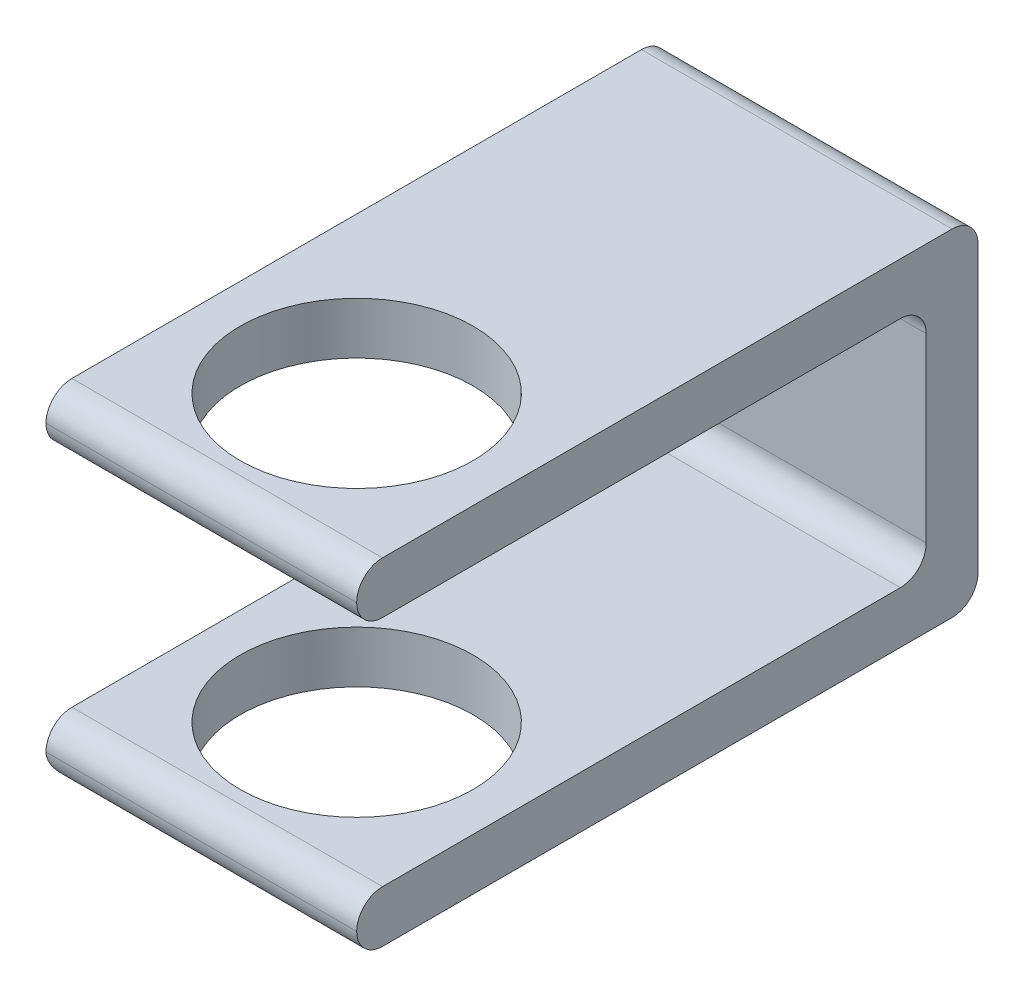
ISO-10303-21;
HEADER;
FILE_DESCRIPTION(('STEP AP214'),'2;1');
FILE_NAME('part.step','',(''),(''),'','','');
FILE_SCHEMA(('AUTOMOTIVE_DESIGN { 1 0 10303 214 1 1 1 1 }'));
ENDSEC;
DATA;
#1=APPLICATION_CONTEXT('core data for automotive mechanical design processes');
#2=APPLICATION_PROTOCOL_DEFINITION('international standard','automotive_design',2000,#1);
#3=PRODUCT_CONTEXT('',#1,'mechanical');
#4=PRODUCT('Part','Part','',(#3));
#5=PRODUCT_RELATED_PRODUCT_CATEGORY('part','',(#4));
#6=PRODUCT_DEFINITION_FORMATION('','',#4);
#7=PRODUCT_DEFINITION_CONTEXT('part definition',#1,'design');
#8=PRODUCT_DEFINITION('design','',#6,#7);
#9=PRODUCT_DEFINITION_SHAPE('','',#8);
#10=(LENGTH_UNIT() NAMED_UNIT(*) SI_UNIT(.MILLI.,.METRE.));
#11=(NAMED_UNIT(*) PLANE_ANGLE_UNIT() SI_UNIT($,.RADIAN.));
#12=(NAMED_UNIT(*) SI_UNIT($,.STERADIAN.) SOLID_ANGLE_UNIT());
#13=UNCERTAINTY_MEASURE_WITH_UNIT(LENGTH_MEASURE(1.E-05),#10,'distance_accuracy_value','');
#14=(GEOMETRIC_REPRESENTATION_CONTEXT(3) GLOBAL_UNCERTAINTY_ASSIGNED_CONTEXT((#13)) GLOBAL_UNIT_ASSIGNED_CONTEXT((#10,
#11,#12)) REPRESENTATION_CONTEXT('',''));
#15=CARTESIAN_POINT('',(0.,0.,0.));
#16=DIRECTION('',(0.,0.,1.));
#17=DIRECTION('',(1.,0.,0.));
#18=AXIS2_PLACEMENT_3D('',#15,#16,#17);
#19=CARTESIAN_POINT('',(19.05,41.275,38.1));
#20=DIRECTION('',(-1.,0.,0.));
#21=DIRECTION('',(0.,0.,1.));
#22=AXIS2_PLACEMENT_3D('',#19,#20,#21);
#23=PLANE('',#22);
#24=DIRECTION('',(0.,0.,-1.));
#25=VECTOR('',#24,1.);
#26=CARTESIAN_POINT('',(19.05,0.,38.1));
#27=LINE('',#26,#25);
#28=CARTESIAN_POINT('',(19.05,0.,34.925));
#29=VERTEX_POINT('',#28);
#30=CARTESIAN_POINT('',(19.05,0.,-34.925));
#31=VERTEX_POINT('',#30);
#32=EDGE_CURVE('E179',#29,#31,#27,.T.);
#33=ORIENTED_EDGE('',*,*,#32,.T.);
#34=CARTESIAN_POINT('',(19.05,3.175,-34.925));
#35=DIRECTION('',(-1.,0.,0.));
#36=DIRECTION('',(0.,0.,1.));
#37=AXIS2_PLACEMENT_3D('',#34,#35,#36);
#38=CIRCLE('',#37,3.175);
#39=CARTESIAN_POINT('',(19.05,3.175,-38.1));
#40=VERTEX_POINT('',#39);
#41=EDGE_CURVE('E215',#31,#40,#38,.F.);
#42=ORIENTED_EDGE('',*,*,#41,.T.);
#43=DIRECTION('',(0.,-1.,0.));
#44=VECTOR('',#43,1.);
#45=CARTESIAN_POINT('',(19.05,41.275,-38.1));
#46=LINE('',#45,#44);
#47=CARTESIAN_POINT('',(19.05,38.1,-38.1));
#48=VERTEX_POINT('',#47);
#49=EDGE_CURVE('E194',#48,#40,#46,.T.);
#50=ORIENTED_EDGE('',*,*,#49,.F.);
#51=CARTESIAN_POINT('',(19.05,38.1,-34.925));
#52=DIRECTION('',(-1.,0.,0.));
#53=DIRECTION('',(0.,0.,1.));
#54=AXIS2_PLACEMENT_3D('',#51,#52,#53);
#55=CIRCLE('',#54,3.175);
#56=CARTESIAN_POINT('',(19.05,41.275,-34.925));
#57=VERTEX_POINT('',#56);
#58=EDGE_CURVE('E172',#48,#57,#55,.F.);
#59=ORIENTED_EDGE('',*,*,#58,.T.);
#60=DIRECTION('',(0.,0.,-1.));
#61=VECTOR('',#60,1.);
#62=CARTESIAN_POINT('',(19.05,41.275,38.1));
#63=LINE('',#62,#61);
#64=CARTESIAN_POINT('',(19.05,41.275,34.925));
#65=VERTEX_POINT('',#64);
#66=EDGE_CURVE('E167',#65,#57,#63,.T.);
#67=ORIENTED_EDGE('',*,*,#66,.F.);
#68=CARTESIAN_POINT('',(19.05,38.1,34.925));
#69=DIRECTION('',(-1.,0.,0.));
#70=DIRECTION('',(0.,0.,1.));
#71=AXIS2_PLACEMENT_3D('',#68,#69,#70);
#72=CIRCLE('',#71,3.175);
#73=CARTESIAN_POINT('',(19.05,38.1,38.1));
#74=VERTEX_POINT('',#73);
#75=EDGE_CURVE('E148',#65,#74,#72,.F.);
#76=ORIENTED_EDGE('',*,*,#75,.T.);
#77=CARTESIAN_POINT('',(19.05,38.1,34.925));
#78=DIRECTION('',(-1.,0.,0.));
#79=DIRECTION('',(0.,0.,1.));
#80=AXIS2_PLACEMENT_3D('',#77,#78,#79);
#81=CIRCLE('',#80,3.175);
#82=CARTESIAN_POINT('',(19.05,34.925,34.925));
#83=VERTEX_POINT('',#82);
#84=EDGE_CURVE('E160',#74,#83,#81,.F.);
#85=ORIENTED_EDGE('',*,*,#84,.T.);
#86=DIRECTION('',(0.,0.,1.));
#87=VECTOR('',#86,1.);
#88=CARTESIAN_POINT('',(19.05,34.925,-85.725));
#89=LINE('',#88,#87);
#90=CARTESIAN_POINT('',(19.05,34.925,-28.575));
#91=VERTEX_POINT('',#90);
#92=EDGE_CURVE('E309',#91,#83,#89,.T.);
#93=ORIENTED_EDGE('',*,*,#92,.F.);
#94=CARTESIAN_POINT('',(19.05,31.75,-28.575));
#95=DIRECTION('',(-1.,0.,0.));
#96=DIRECTION('',(0.,0.,1.));
#97=AXIS2_PLACEMENT_3D('',#94,#95,#96);
#98=CIRCLE('',#97,3.175);
#99=CARTESIAN_POINT('',(19.05,31.75,-31.75));
#100=VERTEX_POINT('',#99);
#101=EDGE_CURVE('E55',#91,#100,#98,.T.);
#102=ORIENTED_EDGE('',*,*,#101,.T.);
#103=DIRECTION('',(0.,-1.,0.));
#104=VECTOR('',#103,1.);
#105=CARTESIAN_POINT('',(19.05,34.925,-31.75));
#106=LINE('',#105,#104);
#107=CARTESIAN_POINT('',(19.05,9.525,-31.75));
#108=VERTEX_POINT('',#107);
#109=EDGE_CURVE('E317',#100,#108,#106,.T.);
#110=ORIENTED_EDGE('',*,*,#109,.T.);
#111=CARTESIAN_POINT('',(19.05,9.525,-28.575));
#112=DIRECTION('',(-1.,0.,0.));
#113=DIRECTION('',(0.,0.,1.));
#114=AXIS2_PLACEMENT_3D('',#111,#112,#113);
#115=CIRCLE('',#114,3.175);
#116=CARTESIAN_POINT('',(19.05,6.35,-28.575));
#117=VERTEX_POINT('',#116);
#118=EDGE_CURVE('E270',#108,#117,#115,.T.);
#119=ORIENTED_EDGE('',*,*,#118,.T.);
#120=DIRECTION('',(0.,0.,1.));
#121=VECTOR('',#120,1.);
#122=CARTESIAN_POINT('',(19.05,6.35,-85.725));
#123=LINE('',#122,#121);
#124=CARTESIAN_POINT('',(19.05,6.35,34.925));
#125=VERTEX_POINT('',#124);
#126=EDGE_CURVE('E306',#117,#125,#123,.T.);
#127=ORIENTED_EDGE('',*,*,#126,.T.);
#128=CARTESIAN_POINT('',(19.05,3.175,34.925));
#129=DIRECTION('',(-1.,0.,0.));
#130=DIRECTION('',(0.,0.,1.));
#131=AXIS2_PLACEMENT_3D('',#128,#129,#130);
#132=CIRCLE('',#131,3.175);
#133=CARTESIAN_POINT('',(19.05,3.175,38.1));
#134=VERTEX_POINT('',#133);
#135=EDGE_CURVE('E159',#125,#134,#132,.F.);
#136=ORIENTED_EDGE('',*,*,#135,.T.);
#137=CARTESIAN_POINT('',(19.05,3.175,34.925));
#138=DIRECTION('',(-1.,0.,0.));
#139=DIRECTION('',(0.,0.,1.));
#140=AXIS2_PLACEMENT_3D('',#137,#138,#139);
#141=CIRCLE('',#140,3.175);
#142=EDGE_CURVE('E212',#134,#29,#141,.F.);
#143=ORIENTED_EDGE('',*,*,#142,.T.);
#144=EDGE_LOOP('',(#33,#42,#50,#59,#67,#76,#85,#93,#102,#110,#119,#127,#136,#143));
#145=FACE_BOUND('',#144,.T.);
#146=ADVANCED_FACE('F45',(#145),#23,.F.);
#147=CARTESIAN_POINT('',(-19.05,41.275,-38.1));
#148=DIRECTION('',(0.,0.,1.));
#149=DIRECTION('',(1.,0.,0.));
#150=AXIS2_PLACEMENT_3D('',#147,#148,#149);
#151=PLANE('',#150);
#152=ORIENTED_EDGE('',*,*,#49,.T.);
#153=DIRECTION('',(-1.,0.,0.));
#154=VECTOR('',#153,1.);
#155=CARTESIAN_POINT('',(-19.05,3.175,-38.1));
#156=LINE('',#155,#154);
#157=CARTESIAN_POINT('',(-19.05,3.175,-38.1));
#158=VERTEX_POINT('',#157);
#159=EDGE_CURVE('E236',#40,#158,#156,.T.);
#160=ORIENTED_EDGE('',*,*,#159,.T.);
#161=DIRECTION('',(0.,-1.,0.));
#162=VECTOR('',#161,1.);
#163=CARTESIAN_POINT('',(-19.05,41.275,-38.1));
#164=LINE('',#163,#162);
#165=CARTESIAN_POINT('',(-19.05,38.1,-38.1));
#166=VERTEX_POINT('',#165);
#167=EDGE_CURVE('E183',#166,#158,#164,.T.);
#168=ORIENTED_EDGE('',*,*,#167,.F.);
#169=DIRECTION('',(-1.,0.,0.));
#170=VECTOR('',#169,1.);
#171=CARTESIAN_POINT('',(-19.05,38.1,-38.1));
#172=LINE('',#171,#170);
#173=EDGE_CURVE('E233',#166,#48,#172,.F.);
#174=ORIENTED_EDGE('',*,*,#173,.T.);
#175=EDGE_LOOP('',(#152,#160,#168,#174));
#176=FACE_BOUND('',#175,.T.);
#177=ADVANCED_FACE('F360',(#176),#151,.F.);
#178=CARTESIAN_POINT('',(-19.05,41.275,38.1));
#179=DIRECTION('',(1.,0.,0.));
#180=DIRECTION('',(0.,0.,-1.));
#181=AXIS2_PLACEMENT_3D('',#178,#179,#180);
#182=PLANE('',#181);
#183=CARTESIAN_POINT('',(-19.05,38.1,34.925));
#184=DIRECTION('',(1.,0.,0.));
#185=DIRECTION('',(0.,0.,-1.));
#186=AXIS2_PLACEMENT_3D('',#183,#184,#185);
#187=CIRCLE('',#186,3.175);
#188=CARTESIAN_POINT('',(-19.05,34.925,34.925));
#189=VERTEX_POINT('',#188);
#190=CARTESIAN_POINT('',(-19.05,38.1,38.1));
#191=VERTEX_POINT('',#190);
#192=EDGE_CURVE('E227',#189,#191,#187,.F.);
#193=ORIENTED_EDGE('',*,*,#192,.T.);
#194=CARTESIAN_POINT('',(-19.05,38.1,34.925));
#195=DIRECTION('',(1.,0.,0.));
#196=DIRECTION('',(0.,0.,-1.));
#197=AXIS2_PLACEMENT_3D('',#194,#195,#196);
#198=CIRCLE('',#197,3.175);
#199=CARTESIAN_POINT('',(-19.05,41.275,34.925));
#200=VERTEX_POINT('',#199);
#201=EDGE_CURVE('E230',#191,#200,#198,.F.);
#202=ORIENTED_EDGE('',*,*,#201,.T.);
#203=DIRECTION('',(0.,0.,1.));
#204=VECTOR('',#203,1.);
#205=CARTESIAN_POINT('',(-19.05,41.275,38.1));
#206=LINE('',#205,#204);
#207=CARTESIAN_POINT('',(-19.05,41.275,-34.925));
#208=VERTEX_POINT('',#207);
#209=EDGE_CURVE('E170',#208,#200,#206,.T.);
#210=ORIENTED_EDGE('',*,*,#209,.F.);
#211=CARTESIAN_POINT('',(-19.05,38.1,-34.925));
#212=DIRECTION('',(1.,0.,0.));
#213=DIRECTION('',(0.,0.,-1.));
#214=AXIS2_PLACEMENT_3D('',#211,#212,#213);
#215=CIRCLE('',#214,3.175);
#216=EDGE_CURVE('E224',#208,#166,#215,.F.);
#217=ORIENTED_EDGE('',*,*,#216,.T.);
#218=ORIENTED_EDGE('',*,*,#167,.T.);
#219=DIRECTION('',(0.,0.,1.));
#220=VECTOR('',#219,1.);
#221=CARTESIAN_POINT('',(-19.05,3.175,38.1));
#222=LINE('',#221,#220);
#223=CARTESIAN_POINT('',(-19.05,3.175,38.1));
#224=VERTEX_POINT('',#223);
#225=EDGE_CURVE('E218',#158,#224,#222,.T.);
#226=ORIENTED_EDGE('',*,*,#225,.T.);
#227=CARTESIAN_POINT('',(-19.05,3.175,34.925));
#228=DIRECTION('',(1.,0.,0.));
#229=DIRECTION('',(0.,0.,-1.));
#230=AXIS2_PLACEMENT_3D('',#227,#228,#229);
#231=CIRCLE('',#230,3.175);
#232=CARTESIAN_POINT('',(-19.05,6.35,34.925));
#233=VERTEX_POINT('',#232);
#234=EDGE_CURVE('E221',#224,#233,#231,.F.);
#235=ORIENTED_EDGE('',*,*,#234,.T.);
#236=DIRECTION('',(0.,0.,1.));
#237=VECTOR('',#236,1.);
#238=CARTESIAN_POINT('',(-19.05,6.35,-85.725));
#239=LINE('',#238,#237);
#240=CARTESIAN_POINT('',(-19.05,6.35,-28.575));
#241=VERTEX_POINT('',#240);
#242=EDGE_CURVE('E188',#241,#233,#239,.T.);
#243=ORIENTED_EDGE('',*,*,#242,.F.);
#244=CARTESIAN_POINT('',(-19.05,9.525,-28.575));
#245=DIRECTION('',(1.,0.,0.));
#246=DIRECTION('',(0.,0.,-1.));
#247=AXIS2_PLACEMENT_3D('',#244,#245,#246);
#248=CIRCLE('',#247,3.175);
#249=CARTESIAN_POINT('',(-19.05,9.525,-31.75));
#250=VERTEX_POINT('',#249);
#251=EDGE_CURVE('E267',#241,#250,#248,.T.);
#252=ORIENTED_EDGE('',*,*,#251,.T.);
#253=DIRECTION('',(0.,1.,0.));
#254=VECTOR('',#253,1.);
#255=CARTESIAN_POINT('',(-19.05,34.925,-31.75));
#256=LINE('',#255,#254);
#257=CARTESIAN_POINT('',(-19.05,31.75,-31.75));
#258=VERTEX_POINT('',#257);
#259=EDGE_CURVE('E185',#250,#258,#256,.T.);
#260=ORIENTED_EDGE('',*,*,#259,.T.);
#261=CARTESIAN_POINT('',(-19.05,31.75,-28.575));
#262=DIRECTION('',(1.,0.,0.));
#263=DIRECTION('',(0.,0.,-1.));
#264=AXIS2_PLACEMENT_3D('',#261,#262,#263);
#265=CIRCLE('',#264,3.175);
#266=CARTESIAN_POINT('',(-19.05,34.925,-28.575));
#267=VERTEX_POINT('',#266);
#268=EDGE_CURVE('E12',#258,#267,#265,.T.);
#269=ORIENTED_EDGE('',*,*,#268,.T.);
#270=DIRECTION('',(0.,0.,1.));
#271=VECTOR('',#270,1.);
#272=CARTESIAN_POINT('',(-19.05,34.925,-85.725));
#273=LINE('',#272,#271);
#274=EDGE_CURVE('E321',#267,#189,#273,.T.);
#275=ORIENTED_EDGE('',*,*,#274,.T.);
#276=EDGE_LOOP('',(#193,#202,#210,#217,#218,#226,#235,#243,#252,#260,#269,#275));
#277=FACE_BOUND('',#276,.T.);
#278=ADVANCED_FACE('F299',(#277),#182,.F.);
#279=CARTESIAN_POINT('',(0.,41.275,0.));
#280=DIRECTION('',(0.,-1.,0.));
#281=DIRECTION('',(0.,0.,-1.));
#282=AXIS2_PLACEMENT_3D('',#279,#280,#281);
#283=PLANE('',#282);
#284=CARTESIAN_POINT('',(0.,41.275,19.05));
#285=DIRECTION('',(0.,1.,0.));
#286=DIRECTION('',(0.,0.,1.));
#287=AXIS2_PLACEMENT_3D('',#284,#285,#286);
#288=CIRCLE('',#287,14.2875);
#289=CARTESIAN_POINT('',(0.,41.275,33.3375));
#290=VERTEX_POINT('',#289);
#291=EDGE_CURVE('E277',#290,#290,#288,.T.);
#292=ORIENTED_EDGE('',*,*,#291,.F.);
#293=EDGE_LOOP('',(#292));
#294=FACE_BOUND('',#293,.T.);
#295=ORIENTED_EDGE('',*,*,#209,.T.);
#296=DIRECTION('',(1.,0.,0.));
#297=VECTOR('',#296,1.);
#298=CARTESIAN_POINT('',(0.,41.275,34.925));
#299=LINE('',#298,#297);
#300=EDGE_CURVE('E152',#200,#65,#299,.T.);
#301=ORIENTED_EDGE('',*,*,#300,.T.);
#302=ORIENTED_EDGE('',*,*,#66,.T.);
#303=DIRECTION('',(-1.,0.,0.));
#304=VECTOR('',#303,1.);
#305=CARTESIAN_POINT('',(0.,41.275,-34.925));
#306=LINE('',#305,#304);
#307=EDGE_CURVE('E173',#57,#208,#306,.T.);
#308=ORIENTED_EDGE('',*,*,#307,.T.);
#309=EDGE_LOOP('',(#295,#301,#302,#308));
#310=FACE_BOUND('',#309,.T.);
#311=ADVANCED_FACE('F165',(#294,#310),#283,.F.);
#312=CARTESIAN_POINT('',(0.,0.,0.));
#313=DIRECTION('',(0.,-1.,0.));
#314=DIRECTION('',(0.,0.,-1.));
#315=AXIS2_PLACEMENT_3D('',#312,#313,#314);
#316=PLANE('',#315);
#317=CARTESIAN_POINT('',(0.,0.,19.05));
#318=DIRECTION('',(0.,1.,0.));
#319=DIRECTION('',(0.,0.,1.));
#320=AXIS2_PLACEMENT_3D('',#317,#318,#319);
#321=CIRCLE('',#320,14.2875);
#322=CARTESIAN_POINT('',(0.,0.,33.3375));
#323=VERTEX_POINT('',#322);
#324=EDGE_CURVE('E203',#323,#323,#321,.T.);
#325=ORIENTED_EDGE('',*,*,#324,.T.);
#326=EDGE_LOOP('',(#325));
#327=FACE_BOUND('',#326,.T.);
#328=DIRECTION('',(0.,0.,1.));
#329=VECTOR('',#328,1.);
#330=CARTESIAN_POINT('',(-15.875,0.,-38.1));
#331=LINE('',#330,#329);
#332=CARTESIAN_POINT('',(-15.875,0.,34.925));
#333=VERTEX_POINT('',#332);
#334=CARTESIAN_POINT('',(-15.875,0.,-34.925));
#335=VERTEX_POINT('',#334);
#336=EDGE_CURVE('E63',#333,#335,#331,.F.);
#337=ORIENTED_EDGE('',*,*,#336,.T.);
#338=DIRECTION('',(-1.,0.,0.));
#339=VECTOR('',#338,1.);
#340=CARTESIAN_POINT('',(19.05,0.,-34.925));
#341=LINE('',#340,#339);
#342=EDGE_CURVE('E244',#335,#31,#341,.F.);
#343=ORIENTED_EDGE('',*,*,#342,.T.);
#344=ORIENTED_EDGE('',*,*,#32,.F.);
#345=DIRECTION('',(1.,0.,0.));
#346=VECTOR('',#345,1.);
#347=CARTESIAN_POINT('',(-19.05,0.,34.925));
#348=LINE('',#347,#346);
#349=EDGE_CURVE('E68',#29,#333,#348,.F.);
#350=ORIENTED_EDGE('',*,*,#349,.T.);
#351=EDGE_LOOP('',(#337,#343,#344,#350));
#352=FACE_BOUND('',#351,.T.);
#353=ADVANCED_FACE('F352',(#327,#352),#316,.T.);
#354=CARTESIAN_POINT('',(-19.05,34.925,-85.725));
#355=DIRECTION('',(0.,1.,0.));
#356=DIRECTION('',(0.,0.,1.));
#357=AXIS2_PLACEMENT_3D('',#354,#355,#356);
#358=PLANE('',#357);
#359=CARTESIAN_POINT('',(0.,34.925,19.05));
#360=DIRECTION('',(0.,1.,0.));
#361=DIRECTION('',(0.,0.,1.));
#362=AXIS2_PLACEMENT_3D('',#359,#360,#361);
#363=CIRCLE('',#362,14.2875);
#364=CARTESIAN_POINT('',(0.,34.925,33.3375));
#365=VERTEX_POINT('',#364);
#366=EDGE_CURVE('E202',#365,#365,#363,.T.);
#367=ORIENTED_EDGE('',*,*,#366,.T.);
#368=EDGE_LOOP('',(#367));
#369=FACE_BOUND('',#368,.T.);
#370=ORIENTED_EDGE('',*,*,#274,.F.);
#371=DIRECTION('',(1.,0.,0.));
#372=VECTOR('',#371,1.);
#373=CARTESIAN_POINT('',(-19.05,34.925,-28.575));
#374=LINE('',#373,#372);
#375=EDGE_CURVE('E263',#267,#91,#374,.T.);
#376=ORIENTED_EDGE('',*,*,#375,.T.);
#377=ORIENTED_EDGE('',*,*,#92,.T.);
#378=DIRECTION('',(-1.,0.,0.));
#379=VECTOR('',#378,1.);
#380=CARTESIAN_POINT('',(-19.05,34.925,34.925));
#381=LINE('',#380,#379);
#382=EDGE_CURVE('E260',#83,#189,#381,.T.);
#383=ORIENTED_EDGE('',*,*,#382,.T.);
#384=EDGE_LOOP('',(#370,#376,#377,#383));
#385=FACE_BOUND('',#384,.T.);
#386=ADVANCED_FACE('F334',(#369,#385),#358,.F.);
#387=CARTESIAN_POINT('',(-19.05,6.35,-85.725));
#388=DIRECTION('',(0.,-1.,0.));
#389=DIRECTION('',(1.,0.,0.));
#390=AXIS2_PLACEMENT_3D('',#387,#388,#389);
#391=PLANE('',#390);
#392=CARTESIAN_POINT('',(0.,6.35,19.05));
#393=DIRECTION('',(0.,-1.,0.));
#394=DIRECTION('',(1.,0.,0.));
#395=AXIS2_PLACEMENT_3D('',#392,#393,#394);
#396=CIRCLE('',#395,14.2875);
#397=CARTESIAN_POINT('',(14.2875,6.35,19.05));
#398=VERTEX_POINT('',#397);
#399=EDGE_CURVE('E198',#398,#398,#396,.T.);
#400=ORIENTED_EDGE('',*,*,#399,.T.);
#401=EDGE_LOOP('',(#400));
#402=FACE_BOUND('',#401,.T.);
#403=ORIENTED_EDGE('',*,*,#242,.T.);
#404=DIRECTION('',(1.,0.,0.));
#405=VECTOR('',#404,1.);
#406=CARTESIAN_POINT('',(-19.05,6.35,34.925));
#407=LINE('',#406,#405);
#408=EDGE_CURVE('E251',#233,#125,#407,.T.);
#409=ORIENTED_EDGE('',*,*,#408,.T.);
#410=ORIENTED_EDGE('',*,*,#126,.F.);
#411=DIRECTION('',(-1.,0.,0.));
#412=VECTOR('',#411,1.);
#413=CARTESIAN_POINT('',(-19.05,6.35,-28.575));
#414=LINE('',#413,#412);
#415=EDGE_CURVE('E247',#117,#241,#414,.T.);
#416=ORIENTED_EDGE('',*,*,#415,.T.);
#417=EDGE_LOOP('',(#403,#409,#410,#416));
#418=FACE_BOUND('',#417,.T.);
#419=ADVANCED_FACE('F301',(#402,#418),#391,.F.);
#420=CARTESIAN_POINT('',(-19.05,41.275,-31.75));
#421=DIRECTION('',(0.,0.,1.));
#422=DIRECTION('',(1.,0.,0.));
#423=AXIS2_PLACEMENT_3D('',#420,#421,#422);
#424=PLANE('',#423);
#425=ORIENTED_EDGE('',*,*,#259,.F.);
#426=DIRECTION('',(-1.,0.,0.));
#427=VECTOR('',#426,1.);
#428=CARTESIAN_POINT('',(-19.05,9.525,-31.75));
#429=LINE('',#428,#427);
#430=EDGE_CURVE('E257',#250,#108,#429,.F.);
#431=ORIENTED_EDGE('',*,*,#430,.T.);
#432=ORIENTED_EDGE('',*,*,#109,.F.);
#433=DIRECTION('',(1.,0.,0.));
#434=VECTOR('',#433,1.);
#435=CARTESIAN_POINT('',(-19.05,31.75,-31.75));
#436=LINE('',#435,#434);
#437=EDGE_CURVE('E254',#100,#258,#436,.F.);
#438=ORIENTED_EDGE('',*,*,#437,.T.);
#439=EDGE_LOOP('',(#425,#431,#432,#438));
#440=FACE_BOUND('',#439,.T.);
#441=ADVANCED_FACE('F347',(#440),#424,.T.);
#442=CARTESIAN_POINT('',(0.,0.,19.05));
#443=DIRECTION('',(0.,1.,0.));
#444=DIRECTION('',(0.,0.,1.));
#445=AXIS2_PLACEMENT_3D('',#442,#443,#444);
#446=CYLINDRICAL_SURFACE('',#445,14.2875);
#447=ORIENTED_EDGE('',*,*,#324,.F.);
#448=EDGE_LOOP('',(#447));
#449=FACE_BOUND('',#448,.T.);
#450=ORIENTED_EDGE('',*,*,#399,.F.);
#451=EDGE_LOOP('',(#450));
#452=FACE_BOUND('',#451,.T.);
#453=ADVANCED_FACE('F453',(#449,#452),#446,.F.);
#454=ORIENTED_EDGE('',*,*,#291,.T.);
#455=EDGE_LOOP('',(#454));
#456=FACE_BOUND('',#455,.T.);
#457=ORIENTED_EDGE('',*,*,#366,.F.);
#458=EDGE_LOOP('',(#457));
#459=FACE_BOUND('',#458,.T.);
#460=ADVANCED_FACE('F379',(#456,#459),#446,.F.);
#461=CARTESIAN_POINT('',(-19.05,38.1,34.925));
#462=DIRECTION('',(-1.,0.,0.));
#463=DIRECTION('',(0.,0.,1.));
#464=AXIS2_PLACEMENT_3D('',#461,#462,#463);
#465=CYLINDRICAL_SURFACE('',#464,3.175);
#466=DIRECTION('',(-1.,0.,0.));
#467=VECTOR('',#466,1.);
#468=CARTESIAN_POINT('',(-19.05,38.1,38.1));
#469=LINE('',#468,#467);
#470=EDGE_CURVE('E154',#191,#74,#469,.F.);
#471=ORIENTED_EDGE('',*,*,#470,.F.);
#472=ORIENTED_EDGE('',*,*,#192,.F.);
#473=ORIENTED_EDGE('',*,*,#382,.F.);
#474=ORIENTED_EDGE('',*,*,#84,.F.);
#475=EDGE_LOOP('',(#471,#472,#473,#474));
#476=FACE_BOUND('',#475,.T.);
#477=ADVANCED_FACE('F338',(#476),#465,.T.);
#478=CARTESIAN_POINT('',(0.,38.1,34.925));
#479=DIRECTION('',(1.,0.,0.));
#480=DIRECTION('',(0.,0.,-1.));
#481=AXIS2_PLACEMENT_3D('',#478,#479,#480);
#482=CYLINDRICAL_SURFACE('',#481,3.175);
#483=ORIENTED_EDGE('',*,*,#201,.F.);
#484=ORIENTED_EDGE('',*,*,#470,.T.);
#485=ORIENTED_EDGE('',*,*,#75,.F.);
#486=ORIENTED_EDGE('',*,*,#300,.F.);
#487=EDGE_LOOP('',(#483,#484,#485,#486));
#488=FACE_BOUND('',#487,.T.);
#489=ADVANCED_FACE('F151',(#488),#482,.T.);
#490=CARTESIAN_POINT('',(-19.05,3.175,34.925));
#491=DIRECTION('',(1.,0.,0.));
#492=DIRECTION('',(0.,1.,0.));
#493=AXIS2_PLACEMENT_3D('',#490,#491,#492);
#494=CYLINDRICAL_SURFACE('',#493,3.175);
#495=DIRECTION('',(1.,0.,0.));
#496=VECTOR('',#495,1.);
#497=CARTESIAN_POINT('',(-19.05,3.175,38.1));
#498=LINE('',#497,#496);
#499=EDGE_CURVE('E49',#134,#224,#498,.F.);
#500=ORIENTED_EDGE('',*,*,#499,.F.);
#501=ORIENTED_EDGE('',*,*,#135,.F.);
#502=ORIENTED_EDGE('',*,*,#408,.F.);
#503=ORIENTED_EDGE('',*,*,#234,.F.);
#504=EDGE_LOOP('',(#500,#501,#502,#503));
#505=FACE_BOUND('',#504,.T.);
#506=ADVANCED_FACE('F294',(#505),#494,.T.);
#507=CARTESIAN_POINT('',(-19.05,3.175,34.925));
#508=DIRECTION('',(-1.,0.,0.));
#509=DIRECTION('',(0.,0.,1.));
#510=AXIS2_PLACEMENT_3D('',#507,#508,#509);
#511=CYLINDRICAL_SURFACE('',#510,3.175);
#512=ORIENTED_EDGE('',*,*,#142,.F.);
#513=ORIENTED_EDGE('',*,*,#499,.T.);
#514=CARTESIAN_POINT('',(-15.875,3.175,34.925));
#515=DIRECTION('',(-0.707106781186547,0.,-0.707106781186547));
#516=DIRECTION('',(0.707106781186547,0.,-0.707106781186547));
#517=AXIS2_PLACEMENT_3D('',#514,#515,#516);
#518=ELLIPSE('',#517,4.49012806053458,3.175);
#519=EDGE_CURVE('E280',#333,#224,#518,.T.);
#520=ORIENTED_EDGE('',*,*,#519,.F.);
#521=ORIENTED_EDGE('',*,*,#349,.F.);
#522=EDGE_LOOP('',(#512,#513,#520,#521));
#523=FACE_BOUND('',#522,.T.);
#524=ADVANCED_FACE('F290',(#523),#511,.T.);
#525=CARTESIAN_POINT('',(-15.875,3.175,38.1));
#526=DIRECTION('',(0.,0.,-1.));
#527=DIRECTION('',(-1.,0.,0.));
#528=AXIS2_PLACEMENT_3D('',#525,#526,#527);
#529=CYLINDRICAL_SURFACE('',#528,3.175);
#530=ORIENTED_EDGE('',*,*,#519,.T.);
#531=ORIENTED_EDGE('',*,*,#225,.F.);
#532=CARTESIAN_POINT('',(-15.875,3.175,-34.925));
#533=DIRECTION('',(0.707106781186547,0.,-0.707106781186547));
#534=DIRECTION('',(-0.707106781186547,0.,-0.707106781186547));
#535=AXIS2_PLACEMENT_3D('',#532,#533,#534);
#536=ELLIPSE('',#535,4.49012806053458,3.175);
#537=EDGE_CURVE('E278',#335,#158,#536,.T.);
#538=ORIENTED_EDGE('',*,*,#537,.F.);
#539=ORIENTED_EDGE('',*,*,#336,.F.);
#540=EDGE_LOOP('',(#530,#531,#538,#539));
#541=FACE_BOUND('',#540,.T.);
#542=ADVANCED_FACE('F357',(#541),#529,.T.);
#543=CARTESIAN_POINT('',(-19.05,3.175,-34.925));
#544=DIRECTION('',(1.,0.,0.));
#545=DIRECTION('',(0.,0.,-1.));
#546=AXIS2_PLACEMENT_3D('',#543,#544,#545);
#547=CYLINDRICAL_SURFACE('',#546,3.175);
#548=ORIENTED_EDGE('',*,*,#41,.F.);
#549=ORIENTED_EDGE('',*,*,#342,.F.);
#550=ORIENTED_EDGE('',*,*,#537,.T.);
#551=ORIENTED_EDGE('',*,*,#159,.F.);
#552=EDGE_LOOP('',(#548,#549,#550,#551));
#553=FACE_BOUND('',#552,.T.);
#554=ADVANCED_FACE('F355',(#553),#547,.T.);
#555=CARTESIAN_POINT('',(-19.05,9.525,-28.575));
#556=DIRECTION('',(-1.,0.,0.));
#557=DIRECTION('',(0.,-1.,0.));
#558=AXIS2_PLACEMENT_3D('',#555,#556,#557);
#559=CYLINDRICAL_SURFACE('',#558,3.175);
#560=ORIENTED_EDGE('',*,*,#118,.F.);
#561=ORIENTED_EDGE('',*,*,#430,.F.);
#562=ORIENTED_EDGE('',*,*,#251,.F.);
#563=ORIENTED_EDGE('',*,*,#415,.F.);
#564=EDGE_LOOP('',(#560,#561,#562,#563));
#565=FACE_BOUND('',#564,.T.);
#566=ADVANCED_FACE('F350',(#565),#559,.F.);
#567=CARTESIAN_POINT('',(-19.05,31.75,-28.575));
#568=DIRECTION('',(1.,0.,0.));
#569=DIRECTION('',(0.,0.,-1.));
#570=AXIS2_PLACEMENT_3D('',#567,#568,#569);
#571=CYLINDRICAL_SURFACE('',#570,3.175);
#572=ORIENTED_EDGE('',*,*,#268,.F.);
#573=ORIENTED_EDGE('',*,*,#437,.F.);
#574=ORIENTED_EDGE('',*,*,#101,.F.);
#575=ORIENTED_EDGE('',*,*,#375,.F.);
#576=EDGE_LOOP('',(#572,#573,#574,#575));
#577=FACE_BOUND('',#576,.T.);
#578=ADVANCED_FACE('F341',(#577),#571,.F.);
#579=CARTESIAN_POINT('',(0.,38.1,-34.925));
#580=DIRECTION('',(-1.,0.,0.));
#581=DIRECTION('',(0.,0.,1.));
#582=AXIS2_PLACEMENT_3D('',#579,#580,#581);
#583=CYLINDRICAL_SURFACE('',#582,3.175);
#584=ORIENTED_EDGE('',*,*,#58,.F.);
#585=ORIENTED_EDGE('',*,*,#173,.F.);
#586=ORIENTED_EDGE('',*,*,#216,.F.);
#587=ORIENTED_EDGE('',*,*,#307,.F.);
#588=EDGE_LOOP('',(#584,#585,#586,#587));
#589=FACE_BOUND('',#588,.T.);
#590=ADVANCED_FACE('F47',(#589),#583,.T.);
#591=CLOSED_SHELL('',(#146,#177,#278,#311,#353,#386,#419,#441,#453,#460,#477,#489,#506,#524,
#542,#554,#566,#578,#590));
#592=MANIFOLD_SOLID_BREP('B2',#591);
#593=ADVANCED_BREP_SHAPE_REPRESENTATION('',(#18,#592),#14);
#594=SHAPE_DEFINITION_REPRESENTATION(#9,#593);
ENDSEC;
END-ISO-10303-21;
